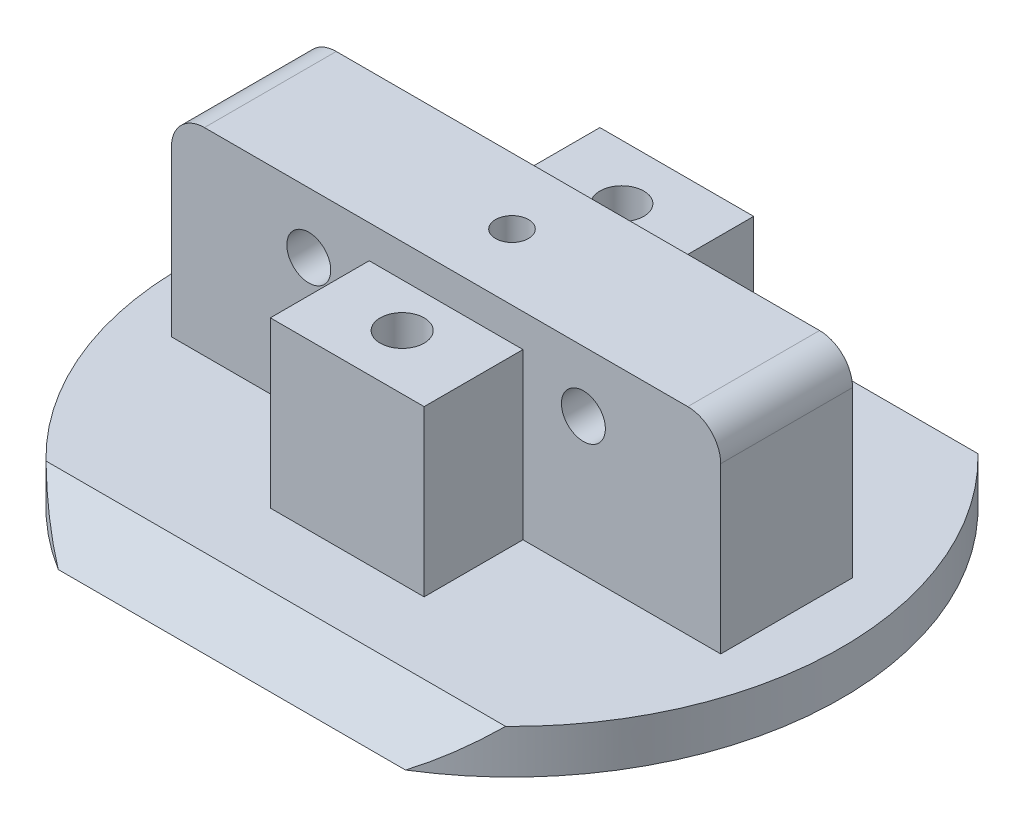
ISO-10303-21;
HEADER;
FILE_DESCRIPTION(('STEP AP214'),'2;1');
FILE_NAME('part.step','',(''),(''),'','','');
FILE_SCHEMA(('AUTOMOTIVE_DESIGN { 1 0 10303 214 1 1 1 1 }'));
ENDSEC;
DATA;
#1=APPLICATION_CONTEXT('core data for automotive mechanical design processes');
#2=APPLICATION_PROTOCOL_DEFINITION('international standard','automotive_design',2000,#1);
#3=PRODUCT_CONTEXT('',#1,'mechanical');
#4=PRODUCT('Part','Part','',(#3));
#5=PRODUCT_RELATED_PRODUCT_CATEGORY('part','',(#4));
#6=PRODUCT_DEFINITION_FORMATION('','',#4);
#7=PRODUCT_DEFINITION_CONTEXT('part definition',#1,'design');
#8=PRODUCT_DEFINITION('design','',#6,#7);
#9=PRODUCT_DEFINITION_SHAPE('','',#8);
#10=(LENGTH_UNIT() NAMED_UNIT(*) SI_UNIT(.MILLI.,.METRE.));
#11=(NAMED_UNIT(*) PLANE_ANGLE_UNIT() SI_UNIT($,.RADIAN.));
#12=(NAMED_UNIT(*) SI_UNIT($,.STERADIAN.) SOLID_ANGLE_UNIT());
#13=UNCERTAINTY_MEASURE_WITH_UNIT(LENGTH_MEASURE(1.E-05),#10,'distance_accuracy_value','');
#14=(GEOMETRIC_REPRESENTATION_CONTEXT(3) GLOBAL_UNCERTAINTY_ASSIGNED_CONTEXT((#13)) GLOBAL_UNIT_ASSIGNED_CONTEXT((#10,
#11,#12)) REPRESENTATION_CONTEXT('',''));
#15=CARTESIAN_POINT('',(0.,0.,0.));
#16=DIRECTION('',(0.,0.,1.));
#17=DIRECTION('',(1.,0.,0.));
#18=AXIS2_PLACEMENT_3D('',#15,#16,#17);
#19=CARTESIAN_POINT('',(0.,4.,0.));
#20=DIRECTION('',(0.,1.,0.));
#21=DIRECTION('',(0.,0.,1.));
#22=AXIS2_PLACEMENT_3D('',#19,#20,#21);
#23=PLANE('',#22);
#24=DIRECTION('',(1.,0.,0.));
#25=VECTOR('',#24,1.);
#26=CARTESIAN_POINT('',(30.001,4.,21.5));
#27=LINE('',#26,#25);
#28=CARTESIAN_POINT('',(-20.9224759529077,4.,21.5));
#29=VERTEX_POINT('',#28);
#30=CARTESIAN_POINT('',(20.9224759529077,4.,21.5));
#31=VERTEX_POINT('',#30);
#32=EDGE_CURVE('E349',#29,#31,#27,.T.);
#33=ORIENTED_EDGE('',*,*,#32,.T.);
#34=CARTESIAN_POINT('',(0.,4.,0.));
#35=DIRECTION('',(0.,1.,0.));
#36=DIRECTION('',(0.,0.,1.));
#37=AXIS2_PLACEMENT_3D('',#34,#35,#36);
#38=CIRCLE('',#37,30.);
#39=CARTESIAN_POINT('',(20.9224759529077,4.,-21.5));
#40=VERTEX_POINT('',#39);
#41=EDGE_CURVE('E347',#31,#40,#38,.T.);
#42=ORIENTED_EDGE('',*,*,#41,.T.);
#43=DIRECTION('',(-1.,0.,0.));
#44=VECTOR('',#43,1.);
#45=CARTESIAN_POINT('',(30.001,4.,-21.5));
#46=LINE('',#45,#44);
#47=CARTESIAN_POINT('',(-20.9224759529077,4.,-21.5));
#48=VERTEX_POINT('',#47);
#49=EDGE_CURVE('E371',#40,#48,#46,.T.);
#50=ORIENTED_EDGE('',*,*,#49,.T.);
#51=CARTESIAN_POINT('',(0.,4.,0.));
#52=DIRECTION('',(0.,1.,0.));
#53=DIRECTION('',(0.,0.,1.));
#54=AXIS2_PLACEMENT_3D('',#51,#52,#53);
#55=CIRCLE('',#54,30.);
#56=EDGE_CURVE('E345',#48,#29,#55,.T.);
#57=ORIENTED_EDGE('',*,*,#56,.T.);
#58=EDGE_LOOP('',(#33,#42,#50,#57));
#59=FACE_BOUND('',#58,.T.);
#60=DIRECTION('',(1.,0.,0.));
#61=VECTOR('',#60,1.);
#62=CARTESIAN_POINT('',(-7.,4.,15.));
#63=LINE('',#62,#61);
#64=CARTESIAN_POINT('',(-7.,4.,15.));
#65=VERTEX_POINT('',#64);
#66=CARTESIAN_POINT('',(7.,4.,15.));
#67=VERTEX_POINT('',#66);
#68=EDGE_CURVE('E185',#65,#67,#63,.T.);
#69=ORIENTED_EDGE('',*,*,#68,.F.);
#70=DIRECTION('',(0.,0.,-1.));
#71=VECTOR('',#70,1.);
#72=CARTESIAN_POINT('',(-7.,4.,15.));
#73=LINE('',#72,#71);
#74=CARTESIAN_POINT('',(-7.,4.,6.));
#75=VERTEX_POINT('',#74);
#76=EDGE_CURVE('E215',#65,#75,#73,.T.);
#77=ORIENTED_EDGE('',*,*,#76,.T.);
#78=DIRECTION('',(1.,0.,0.));
#79=VECTOR('',#78,1.);
#80=CARTESIAN_POINT('',(-25.,4.,6.));
#81=LINE('',#80,#79);
#82=CARTESIAN_POINT('',(-25.,4.,6.));
#83=VERTEX_POINT('',#82);
#84=EDGE_CURVE('E266',#83,#75,#81,.T.);
#85=ORIENTED_EDGE('',*,*,#84,.F.);
#86=DIRECTION('',(0.,0.,1.));
#87=VECTOR('',#86,1.);
#88=CARTESIAN_POINT('',(-25.,4.,-6.));
#89=LINE('',#88,#87);
#90=CARTESIAN_POINT('',(-25.,4.,-6.));
#91=VERTEX_POINT('',#90);
#92=EDGE_CURVE('E275',#91,#83,#89,.T.);
#93=ORIENTED_EDGE('',*,*,#92,.F.);
#94=DIRECTION('',(-1.,0.,0.));
#95=VECTOR('',#94,1.);
#96=CARTESIAN_POINT('',(-25.,4.,-6.));
#97=LINE('',#96,#95);
#98=CARTESIAN_POINT('',(-7.,4.,-6.));
#99=VERTEX_POINT('',#98);
#100=EDGE_CURVE('E271',#99,#91,#97,.T.);
#101=ORIENTED_EDGE('',*,*,#100,.F.);
#102=DIRECTION('',(0.,0.,1.));
#103=VECTOR('',#102,1.);
#104=CARTESIAN_POINT('',(-7.,4.,-15.));
#105=LINE('',#104,#103);
#106=CARTESIAN_POINT('',(-7.,4.,-15.));
#107=VERTEX_POINT('',#106);
#108=EDGE_CURVE('E256',#107,#99,#105,.T.);
#109=ORIENTED_EDGE('',*,*,#108,.F.);
#110=DIRECTION('',(-1.,0.,0.));
#111=VECTOR('',#110,1.);
#112=CARTESIAN_POINT('',(7.,4.,-15.));
#113=LINE('',#112,#111);
#114=CARTESIAN_POINT('',(7.,4.,-15.));
#115=VERTEX_POINT('',#114);
#116=EDGE_CURVE('E235',#115,#107,#113,.T.);
#117=ORIENTED_EDGE('',*,*,#116,.F.);
#118=DIRECTION('',(0.,0.,1.));
#119=VECTOR('',#118,1.);
#120=CARTESIAN_POINT('',(7.,4.,-15.));
#121=LINE('',#120,#119);
#122=CARTESIAN_POINT('',(7.,4.,-6.));
#123=VERTEX_POINT('',#122);
#124=EDGE_CURVE('E259',#115,#123,#121,.T.);
#125=ORIENTED_EDGE('',*,*,#124,.T.);
#126=CARTESIAN_POINT('',(25.,4.,-6.));
#127=VERTEX_POINT('',#126);
#128=EDGE_CURVE('E272',#127,#123,#97,.T.);
#129=ORIENTED_EDGE('',*,*,#128,.F.);
#130=DIRECTION('',(0.,0.,-1.));
#131=VECTOR('',#130,1.);
#132=CARTESIAN_POINT('',(25.,4.,-6.));
#133=LINE('',#132,#131);
#134=CARTESIAN_POINT('',(25.,4.,6.));
#135=VERTEX_POINT('',#134);
#136=EDGE_CURVE('E261',#135,#127,#133,.T.);
#137=ORIENTED_EDGE('',*,*,#136,.F.);
#138=CARTESIAN_POINT('',(7.,4.,6.));
#139=VERTEX_POINT('',#138);
#140=EDGE_CURVE('E278',#139,#135,#81,.T.);
#141=ORIENTED_EDGE('',*,*,#140,.F.);
#142=DIRECTION('',(0.,0.,-1.));
#143=VECTOR('',#142,1.);
#144=CARTESIAN_POINT('',(7.,4.,15.));
#145=LINE('',#144,#143);
#146=EDGE_CURVE('E196',#67,#139,#145,.T.);
#147=ORIENTED_EDGE('',*,*,#146,.F.);
#148=EDGE_LOOP('',(#69,#77,#85,#93,#101,#109,#117,#125,#129,#137,#141,#147));
#149=FACE_BOUND('',#148,.T.);
#150=ADVANCED_FACE('F54',(#59,#149),#23,.T.);
#151=CARTESIAN_POINT('',(-25.,22.,6.));
#152=DIRECTION('',(0.,0.,-1.));
#153=DIRECTION('',(-1.,0.,0.));
#154=AXIS2_PLACEMENT_3D('',#151,#152,#153);
#155=PLANE('',#154);
#156=CARTESIAN_POINT('',(-12.5,16.5,6.));
#157=DIRECTION('',(0.,0.,-1.));
#158=DIRECTION('',(-1.,0.,0.));
#159=AXIS2_PLACEMENT_3D('',#156,#157,#158);
#160=CIRCLE('',#159,2.);
#161=CARTESIAN_POINT('',(-14.5,16.5,6.));
#162=VERTEX_POINT('',#161);
#163=EDGE_CURVE('E221',#162,#162,#160,.T.);
#164=ORIENTED_EDGE('',*,*,#163,.T.);
#165=EDGE_LOOP('',(#164));
#166=FACE_BOUND('',#165,.T.);
#167=CARTESIAN_POINT('',(12.5,16.5,6.));
#168=DIRECTION('',(0.,0.,-1.));
#169=DIRECTION('',(-1.,0.,0.));
#170=AXIS2_PLACEMENT_3D('',#167,#168,#169);
#171=CIRCLE('',#170,2.);
#172=CARTESIAN_POINT('',(10.5,16.5,6.));
#173=VERTEX_POINT('',#172);
#174=EDGE_CURVE('E227',#173,#173,#171,.T.);
#175=ORIENTED_EDGE('',*,*,#174,.T.);
#176=EDGE_LOOP('',(#175));
#177=FACE_BOUND('',#176,.T.);
#178=DIRECTION('',(1.,0.,0.));
#179=VECTOR('',#178,1.);
#180=CARTESIAN_POINT('',(-25.,22.,6.));
#181=LINE('',#180,#179);
#182=CARTESIAN_POINT('',(-22.,22.,6.));
#183=VERTEX_POINT('',#182);
#184=CARTESIAN_POINT('',(22.,22.,6.));
#185=VERTEX_POINT('',#184);
#186=EDGE_CURVE('E265',#183,#185,#181,.T.);
#187=ORIENTED_EDGE('',*,*,#186,.F.);
#188=CARTESIAN_POINT('',(-22.,19.,6.));
#189=DIRECTION('',(0.,0.,-1.));
#190=DIRECTION('',(-1.,0.,0.));
#191=AXIS2_PLACEMENT_3D('',#188,#189,#190);
#192=CIRCLE('',#191,3.);
#193=CARTESIAN_POINT('',(-25.,19.,6.));
#194=VERTEX_POINT('',#193);
#195=EDGE_CURVE('E77',#183,#194,#192,.F.);
#196=ORIENTED_EDGE('',*,*,#195,.T.);
#197=DIRECTION('',(0.,-1.,0.));
#198=VECTOR('',#197,1.);
#199=CARTESIAN_POINT('',(-25.,22.,6.));
#200=LINE('',#199,#198);
#201=EDGE_CURVE('E282',#194,#83,#200,.T.);
#202=ORIENTED_EDGE('',*,*,#201,.T.);
#203=ORIENTED_EDGE('',*,*,#84,.T.);
#204=DIRECTION('',(0.,-1.,0.));
#205=VECTOR('',#204,1.);
#206=CARTESIAN_POINT('',(-7.,4.,6.));
#207=LINE('',#206,#205);
#208=CARTESIAN_POINT('',(-7.,19.,6.));
#209=VERTEX_POINT('',#208);
#210=EDGE_CURVE('E206',#209,#75,#207,.T.);
#211=ORIENTED_EDGE('',*,*,#210,.F.);
#212=DIRECTION('',(-1.,0.,0.));
#213=VECTOR('',#212,1.);
#214=CARTESIAN_POINT('',(-7.,19.,6.));
#215=LINE('',#214,#213);
#216=CARTESIAN_POINT('',(7.,19.,6.));
#217=VERTEX_POINT('',#216);
#218=EDGE_CURVE('E211',#217,#209,#215,.T.);
#219=ORIENTED_EDGE('',*,*,#218,.F.);
#220=DIRECTION('',(0.,1.,0.));
#221=VECTOR('',#220,1.);
#222=CARTESIAN_POINT('',(7.,4.,6.));
#223=LINE('',#222,#221);
#224=EDGE_CURVE('E193',#139,#217,#223,.T.);
#225=ORIENTED_EDGE('',*,*,#224,.F.);
#226=ORIENTED_EDGE('',*,*,#140,.T.);
#227=DIRECTION('',(0.,-1.,0.));
#228=VECTOR('',#227,1.);
#229=CARTESIAN_POINT('',(25.,22.,6.));
#230=LINE('',#229,#228);
#231=CARTESIAN_POINT('',(25.,19.,6.));
#232=VERTEX_POINT('',#231);
#233=EDGE_CURVE('E268',#232,#135,#230,.T.);
#234=ORIENTED_EDGE('',*,*,#233,.F.);
#235=CARTESIAN_POINT('',(22.,19.,6.));
#236=DIRECTION('',(0.,0.,-1.));
#237=DIRECTION('',(-1.,0.,0.));
#238=AXIS2_PLACEMENT_3D('',#235,#236,#237);
#239=CIRCLE('',#238,3.);
#240=EDGE_CURVE('E384',#232,#185,#239,.F.);
#241=ORIENTED_EDGE('',*,*,#240,.T.);
#242=EDGE_LOOP('',(#187,#196,#202,#203,#211,#219,#225,#226,#234,#241));
#243=FACE_BOUND('',#242,.T.);
#244=ADVANCED_FACE('F397',(#166,#177,#243),#155,.F.);
#245=CARTESIAN_POINT('',(-25.,22.,-6.));
#246=DIRECTION('',(0.,0.,1.));
#247=DIRECTION('',(1.,0.,0.));
#248=AXIS2_PLACEMENT_3D('',#245,#246,#247);
#249=PLANE('',#248);
#250=CARTESIAN_POINT('',(12.5,16.5,-6.));
#251=DIRECTION('',(0.,0.,1.));
#252=DIRECTION('',(1.,0.,0.));
#253=AXIS2_PLACEMENT_3D('',#250,#251,#252);
#254=CIRCLE('',#253,2.);
#255=CARTESIAN_POINT('',(14.5,16.5,-6.));
#256=VERTEX_POINT('',#255);
#257=EDGE_CURVE('E228',#256,#256,#254,.T.);
#258=ORIENTED_EDGE('',*,*,#257,.T.);
#259=EDGE_LOOP('',(#258));
#260=FACE_BOUND('',#259,.T.);
#261=CARTESIAN_POINT('',(-12.5,16.5,-6.));
#262=DIRECTION('',(0.,0.,1.));
#263=DIRECTION('',(1.,0.,0.));
#264=AXIS2_PLACEMENT_3D('',#261,#262,#263);
#265=CIRCLE('',#264,2.);
#266=CARTESIAN_POINT('',(-10.5,16.5,-6.));
#267=VERTEX_POINT('',#266);
#268=EDGE_CURVE('E224',#267,#267,#265,.T.);
#269=ORIENTED_EDGE('',*,*,#268,.T.);
#270=EDGE_LOOP('',(#269));
#271=FACE_BOUND('',#270,.T.);
#272=DIRECTION('',(0.,-1.,0.));
#273=VECTOR('',#272,1.);
#274=CARTESIAN_POINT('',(-25.,22.,-6.));
#275=LINE('',#274,#273);
#276=CARTESIAN_POINT('',(-25.,19.,-6.));
#277=VERTEX_POINT('',#276);
#278=EDGE_CURVE('E284',#277,#91,#275,.T.);
#279=ORIENTED_EDGE('',*,*,#278,.F.);
#280=CARTESIAN_POINT('',(-22.,19.,-6.));
#281=DIRECTION('',(0.,0.,1.));
#282=DIRECTION('',(1.,0.,0.));
#283=AXIS2_PLACEMENT_3D('',#280,#281,#282);
#284=CIRCLE('',#283,3.);
#285=CARTESIAN_POINT('',(-22.,22.,-6.));
#286=VERTEX_POINT('',#285);
#287=EDGE_CURVE('E13',#277,#286,#284,.F.);
#288=ORIENTED_EDGE('',*,*,#287,.T.);
#289=DIRECTION('',(-1.,0.,0.));
#290=VECTOR('',#289,1.);
#291=CARTESIAN_POINT('',(-25.,22.,-6.));
#292=LINE('',#291,#290);
#293=CARTESIAN_POINT('',(22.,22.,-6.));
#294=VERTEX_POINT('',#293);
#295=EDGE_CURVE('E262',#294,#286,#292,.T.);
#296=ORIENTED_EDGE('',*,*,#295,.F.);
#297=CARTESIAN_POINT('',(22.,19.,-6.));
#298=DIRECTION('',(0.,0.,1.));
#299=DIRECTION('',(1.,0.,0.));
#300=AXIS2_PLACEMENT_3D('',#297,#298,#299);
#301=CIRCLE('',#300,3.);
#302=CARTESIAN_POINT('',(25.,19.,-6.));
#303=VERTEX_POINT('',#302);
#304=EDGE_CURVE('E380',#294,#303,#301,.F.);
#305=ORIENTED_EDGE('',*,*,#304,.T.);
#306=DIRECTION('',(0.,-1.,0.));
#307=VECTOR('',#306,1.);
#308=CARTESIAN_POINT('',(25.,22.,-6.));
#309=LINE('',#308,#307);
#310=EDGE_CURVE('E286',#303,#127,#309,.T.);
#311=ORIENTED_EDGE('',*,*,#310,.T.);
#312=ORIENTED_EDGE('',*,*,#128,.T.);
#313=DIRECTION('',(0.,-1.,0.));
#314=VECTOR('',#313,1.);
#315=CARTESIAN_POINT('',(7.,4.,-6.));
#316=LINE('',#315,#314);
#317=CARTESIAN_POINT('',(7.,19.,-6.));
#318=VERTEX_POINT('',#317);
#319=EDGE_CURVE('E231',#318,#123,#316,.T.);
#320=ORIENTED_EDGE('',*,*,#319,.F.);
#321=DIRECTION('',(1.,0.,0.));
#322=VECTOR('',#321,1.);
#323=CARTESIAN_POINT('',(7.,19.,-6.));
#324=LINE('',#323,#322);
#325=CARTESIAN_POINT('',(-7.,19.,-6.));
#326=VERTEX_POINT('',#325);
#327=EDGE_CURVE('E236',#326,#318,#324,.T.);
#328=ORIENTED_EDGE('',*,*,#327,.F.);
#329=DIRECTION('',(0.,1.,0.));
#330=VECTOR('',#329,1.);
#331=CARTESIAN_POINT('',(-7.,4.,-6.));
#332=LINE('',#331,#330);
#333=EDGE_CURVE('E246',#99,#326,#332,.T.);
#334=ORIENTED_EDGE('',*,*,#333,.F.);
#335=ORIENTED_EDGE('',*,*,#100,.T.);
#336=EDGE_LOOP('',(#279,#288,#296,#305,#311,#312,#320,#328,#334,#335));
#337=FACE_BOUND('',#336,.T.);
#338=ADVANCED_FACE('F406',(#260,#271,#337),#249,.F.);
#339=CARTESIAN_POINT('',(0.,0.,0.));
#340=DIRECTION('',(0.,1.,0.));
#341=DIRECTION('',(0.,0.,1.));
#342=AXIS2_PLACEMENT_3D('',#339,#340,#341);
#343=PLANE('',#342);
#344=CARTESIAN_POINT('',(22.,0.,0.));
#345=DIRECTION('',(0.,-1.,0.));
#346=DIRECTION('',(0.,0.,-1.));
#347=AXIS2_PLACEMENT_3D('',#344,#345,#346);
#348=CIRCLE('',#347,5.);
#349=CARTESIAN_POINT('',(22.,0.,-5.));
#350=VERTEX_POINT('',#349);
#351=EDGE_CURVE('E311',#350,#350,#348,.T.);
#352=ORIENTED_EDGE('',*,*,#351,.F.);
#353=EDGE_LOOP('',(#352));
#354=FACE_BOUND('',#353,.T.);
#355=CARTESIAN_POINT('',(0.,0.,15.));
#356=DIRECTION('',(0.,-1.,0.));
#357=DIRECTION('',(0.,0.,-1.));
#358=AXIS2_PLACEMENT_3D('',#355,#356,#357);
#359=CIRCLE('',#358,5.);
#360=CARTESIAN_POINT('',(0.,0.,10.));
#361=VERTEX_POINT('',#360);
#362=EDGE_CURVE('E317',#361,#361,#359,.T.);
#363=ORIENTED_EDGE('',*,*,#362,.F.);
#364=EDGE_LOOP('',(#363));
#365=FACE_BOUND('',#364,.T.);
#366=CARTESIAN_POINT('',(-22.,0.,0.));
#367=DIRECTION('',(0.,-1.,0.));
#368=DIRECTION('',(0.,0.,-1.));
#369=AXIS2_PLACEMENT_3D('',#366,#367,#368);
#370=CIRCLE('',#369,5.);
#371=CARTESIAN_POINT('',(-22.,0.,-5.));
#372=VERTEX_POINT('',#371);
#373=EDGE_CURVE('E323',#372,#372,#370,.T.);
#374=ORIENTED_EDGE('',*,*,#373,.F.);
#375=EDGE_LOOP('',(#374));
#376=FACE_BOUND('',#375,.T.);
#377=CARTESIAN_POINT('',(-14.,0.,12.));
#378=DIRECTION('',(0.,-1.,0.));
#379=DIRECTION('',(0.,0.,-1.));
#380=AXIS2_PLACEMENT_3D('',#377,#378,#379);
#381=CIRCLE('',#380,5.);
#382=CARTESIAN_POINT('',(-14.,0.,7.));
#383=VERTEX_POINT('',#382);
#384=EDGE_CURVE('E292',#383,#383,#381,.T.);
#385=ORIENTED_EDGE('',*,*,#384,.F.);
#386=EDGE_LOOP('',(#385));
#387=FACE_BOUND('',#386,.T.);
#388=CARTESIAN_POINT('',(14.,0.,12.));
#389=DIRECTION('',(0.,-1.,0.));
#390=DIRECTION('',(0.,0.,-1.));
#391=AXIS2_PLACEMENT_3D('',#388,#389,#390);
#392=CIRCLE('',#391,5.);
#393=CARTESIAN_POINT('',(14.,0.,7.));
#394=VERTEX_POINT('',#393);
#395=EDGE_CURVE('E293',#394,#394,#392,.T.);
#396=ORIENTED_EDGE('',*,*,#395,.F.);
#397=EDGE_LOOP('',(#396));
#398=FACE_BOUND('',#397,.T.);
#399=CARTESIAN_POINT('',(14.,0.,-12.));
#400=DIRECTION('',(0.,-1.,0.));
#401=DIRECTION('',(0.,0.,-1.));
#402=AXIS2_PLACEMENT_3D('',#399,#400,#401);
#403=CIRCLE('',#402,5.);
#404=CARTESIAN_POINT('',(14.,0.,-17.));
#405=VERTEX_POINT('',#404);
#406=EDGE_CURVE('E299',#405,#405,#403,.T.);
#407=ORIENTED_EDGE('',*,*,#406,.F.);
#408=EDGE_LOOP('',(#407));
#409=FACE_BOUND('',#408,.T.);
#410=CARTESIAN_POINT('',(-14.,0.,-12.));
#411=DIRECTION('',(0.,-1.,0.));
#412=DIRECTION('',(0.,0.,-1.));
#413=AXIS2_PLACEMENT_3D('',#410,#411,#412);
#414=CIRCLE('',#413,5.);
#415=CARTESIAN_POINT('',(-14.,0.,-17.));
#416=VERTEX_POINT('',#415);
#417=EDGE_CURVE('E288',#416,#416,#414,.T.);
#418=ORIENTED_EDGE('',*,*,#417,.F.);
#419=EDGE_LOOP('',(#418));
#420=FACE_BOUND('',#419,.T.);
#421=CARTESIAN_POINT('',(0.,0.,-15.));
#422=DIRECTION('',(0.,-1.,0.));
#423=DIRECTION('',(0.,0.,-1.));
#424=AXIS2_PLACEMENT_3D('',#421,#422,#423);
#425=CIRCLE('',#424,5.);
#426=CARTESIAN_POINT('',(0.,0.,-20.));
#427=VERTEX_POINT('',#426);
#428=EDGE_CURVE('E310',#427,#427,#425,.T.);
#429=ORIENTED_EDGE('',*,*,#428,.F.);
#430=EDGE_LOOP('',(#429));
#431=FACE_BOUND('',#430,.T.);
#432=CARTESIAN_POINT('',(0.,0.,0.));
#433=DIRECTION('',(0.,1.,0.));
#434=DIRECTION('',(0.,0.,1.));
#435=AXIS2_PLACEMENT_3D('',#432,#433,#434);
#436=CIRCLE('',#435,1.5);
#437=CARTESIAN_POINT('',(0.,0.,1.5));
#438=VERTEX_POINT('',#437);
#439=EDGE_CURVE('E334',#438,#438,#436,.T.);
#440=ORIENTED_EDGE('',*,*,#439,.T.);
#441=EDGE_LOOP('',(#440));
#442=FACE_BOUND('',#441,.T.);
#443=CARTESIAN_POINT('',(-8.,0.,0.));
#444=DIRECTION('',(0.,1.,0.));
#445=DIRECTION('',(0.,0.,1.));
#446=AXIS2_PLACEMENT_3D('',#443,#444,#445);
#447=CIRCLE('',#446,5.);
#448=CARTESIAN_POINT('',(-8.,0.,5.));
#449=VERTEX_POINT('',#448);
#450=EDGE_CURVE('E342',#449,#449,#447,.T.);
#451=ORIENTED_EDGE('',*,*,#450,.T.);
#452=EDGE_LOOP('',(#451));
#453=FACE_BOUND('',#452,.T.);
#454=CARTESIAN_POINT('',(8.,0.,0.));
#455=DIRECTION('',(0.,1.,0.));
#456=DIRECTION('',(0.,0.,1.));
#457=AXIS2_PLACEMENT_3D('',#454,#455,#456);
#458=CIRCLE('',#457,5.);
#459=CARTESIAN_POINT('',(8.,0.,5.));
#460=VERTEX_POINT('',#459);
#461=EDGE_CURVE('E339',#460,#460,#458,.T.);
#462=ORIENTED_EDGE('',*,*,#461,.T.);
#463=EDGE_LOOP('',(#462));
#464=FACE_BOUND('',#463,.T.);
#465=DIRECTION('',(1.,0.,0.));
#466=VECTOR('',#465,1.);
#467=CARTESIAN_POINT('',(0.,0.,25.5));
#468=LINE('',#467,#466);
#469=CARTESIAN_POINT('',(-15.8034806292791,0.,25.5));
#470=VERTEX_POINT('',#469);
#471=CARTESIAN_POINT('',(15.8034806292791,0.,25.5));
#472=VERTEX_POINT('',#471);
#473=EDGE_CURVE('E351',#470,#472,#468,.T.);
#474=ORIENTED_EDGE('',*,*,#473,.F.);
#475=CARTESIAN_POINT('',(0.,0.,0.));
#476=DIRECTION('',(0.,1.,0.));
#477=DIRECTION('',(0.,0.,1.));
#478=AXIS2_PLACEMENT_3D('',#475,#476,#477);
#479=CIRCLE('',#478,30.);
#480=CARTESIAN_POINT('',(-15.8034806292789,0.,-25.5000000000001));
#481=VERTEX_POINT('',#480);
#482=EDGE_CURVE('E368',#481,#470,#479,.T.);
#483=ORIENTED_EDGE('',*,*,#482,.F.);
#484=DIRECTION('',(-1.,0.,0.));
#485=VECTOR('',#484,1.);
#486=CARTESIAN_POINT('',(0.,0.,-25.5000000000001));
#487=LINE('',#486,#485);
#488=CARTESIAN_POINT('',(15.8034806292789,0.,-25.5000000000001));
#489=VERTEX_POINT('',#488);
#490=EDGE_CURVE('E354',#489,#481,#487,.T.);
#491=ORIENTED_EDGE('',*,*,#490,.F.);
#492=EDGE_CURVE('E365',#472,#489,#479,.T.);
#493=ORIENTED_EDGE('',*,*,#492,.F.);
#494=EDGE_LOOP('',(#474,#483,#491,#493));
#495=FACE_BOUND('',#494,.T.);
#496=ADVANCED_FACE('F436',(#354,#365,#376,#387,#398,#409,#420,#431,#442,#453,#464,#495),#343,.F.);
#497=CARTESIAN_POINT('',(0.,4.,0.));
#498=DIRECTION('',(0.,-1.,0.));
#499=DIRECTION('',(0.,0.,-1.));
#500=AXIS2_PLACEMENT_3D('',#497,#498,#499);
#501=CYLINDRICAL_SURFACE('',#500,30.);
#502=ORIENTED_EDGE('',*,*,#41,.F.);
#503=CARTESIAN_POINT('',(0.,25.4999999999998,0.));
#504=DIRECTION('',(0.,-0.707106781186551,-0.707106781186544));
#505=DIRECTION('',(0.,-0.707106781186544,0.707106781186551));
#506=AXIS2_PLACEMENT_3D('',#503,#504,#505);
#507=ELLIPSE('',#506,42.4264068711926,30.);
#508=EDGE_CURVE('E362',#472,#31,#507,.F.);
#509=ORIENTED_EDGE('',*,*,#508,.F.);
#510=ORIENTED_EDGE('',*,*,#492,.T.);
#511=CARTESIAN_POINT('',(0.,25.4999999999995,0.));
#512=DIRECTION('',(0.,-0.707106781186556,0.707106781186539));
#513=DIRECTION('',(0.,-0.707106781186539,-0.707106781186556));
#514=AXIS2_PLACEMENT_3D('',#511,#512,#513);
#515=ELLIPSE('',#514,42.4264068711924,30.);
#516=EDGE_CURVE('E363',#40,#489,#515,.F.);
#517=ORIENTED_EDGE('',*,*,#516,.F.);
#518=EDGE_LOOP('',(#502,#509,#510,#517));
#519=FACE_BOUND('',#518,.T.);
#520=ADVANCED_FACE('F439',(#519),#501,.T.);
#521=ORIENTED_EDGE('',*,*,#56,.F.);
#522=CARTESIAN_POINT('',(0.,25.4999999999995,0.));
#523=DIRECTION('',(0.,0.707106781186556,-0.707106781186539));
#524=DIRECTION('',(0.,-0.707106781186539,-0.707106781186556));
#525=AXIS2_PLACEMENT_3D('',#522,#523,#524);
#526=ELLIPSE('',#525,42.4264068711924,30.);
#527=EDGE_CURVE('E357',#48,#481,#526,.F.);
#528=ORIENTED_EDGE('',*,*,#527,.T.);
#529=ORIENTED_EDGE('',*,*,#482,.T.);
#530=CARTESIAN_POINT('',(0.,25.4999999999998,0.));
#531=DIRECTION('',(0.,0.707106781186551,0.707106781186544));
#532=DIRECTION('',(0.,-0.707106781186544,0.707106781186551));
#533=AXIS2_PLACEMENT_3D('',#530,#531,#532);
#534=ELLIPSE('',#533,42.4264068711926,30.);
#535=EDGE_CURVE('E359',#470,#29,#534,.F.);
#536=ORIENTED_EDGE('',*,*,#535,.T.);
#537=EDGE_LOOP('',(#521,#528,#529,#536));
#538=FACE_BOUND('',#537,.T.);
#539=ADVANCED_FACE('F431',(#538),#501,.T.);
#540=CARTESIAN_POINT('',(30.001,16.5,8.99999999999987));
#541=DIRECTION('',(0.,-0.707106781186551,-0.707106781186544));
#542=DIRECTION('',(0.,0.707106781186544,-0.707106781186551));
#543=AXIS2_PLACEMENT_3D('',#540,#541,#542);
#544=PLANE('',#543);
#545=ORIENTED_EDGE('',*,*,#32,.F.);
#546=ORIENTED_EDGE('',*,*,#535,.F.);
#547=ORIENTED_EDGE('',*,*,#473,.T.);
#548=ORIENTED_EDGE('',*,*,#508,.T.);
#549=EDGE_LOOP('',(#545,#546,#547,#548));
#550=FACE_BOUND('',#549,.T.);
#551=ADVANCED_FACE('F427',(#550),#544,.F.);
#552=CARTESIAN_POINT('',(30.001,16.5,-8.99999999999971));
#553=DIRECTION('',(0.,-0.707106781186556,0.707106781186539));
#554=DIRECTION('',(0.,-0.707106781186539,-0.707106781186556));
#555=AXIS2_PLACEMENT_3D('',#552,#553,#554);
#556=PLANE('',#555);
#557=ORIENTED_EDGE('',*,*,#49,.F.);
#558=ORIENTED_EDGE('',*,*,#516,.T.);
#559=ORIENTED_EDGE('',*,*,#490,.T.);
#560=ORIENTED_EDGE('',*,*,#527,.F.);
#561=EDGE_LOOP('',(#557,#558,#559,#560));
#562=FACE_BOUND('',#561,.T.);
#563=ADVANCED_FACE('F430',(#562),#556,.F.);
#564=CARTESIAN_POINT('',(8.,-7.50000000000001,0.));
#565=DIRECTION('',(0.,1.,0.));
#566=DIRECTION('',(0.,0.,1.));
#567=AXIS2_PLACEMENT_3D('',#564,#565,#566);
#568=CYLINDRICAL_SURFACE('',#567,5.);
#569=ORIENTED_EDGE('',*,*,#461,.F.);
#570=EDGE_LOOP('',(#569));
#571=FACE_BOUND('',#570,.T.);
#572=CARTESIAN_POINT('',(8.,13.,0.));
#573=DIRECTION('',(0.,-1.,0.));
#574=DIRECTION('',(0.,0.,-1.));
#575=AXIS2_PLACEMENT_3D('',#572,#573,#574);
#576=CIRCLE('',#575,5.);
#577=CARTESIAN_POINT('',(8.,13.,-5.));
#578=VERTEX_POINT('',#577);
#579=EDGE_CURVE('E928',#578,#578,#576,.T.);
#580=ORIENTED_EDGE('',*,*,#579,.F.);
#581=EDGE_LOOP('',(#580));
#582=FACE_BOUND('',#581,.T.);
#583=ADVANCED_FACE('F425',(#571,#582),#568,.F.);
#584=CARTESIAN_POINT('',(-8.,-7.50000000000001,0.));
#585=DIRECTION('',(0.,1.,0.));
#586=DIRECTION('',(0.,0.,1.));
#587=AXIS2_PLACEMENT_3D('',#584,#585,#586);
#588=CYLINDRICAL_SURFACE('',#587,5.);
#589=ORIENTED_EDGE('',*,*,#450,.F.);
#590=EDGE_LOOP('',(#589));
#591=FACE_BOUND('',#590,.T.);
#592=CARTESIAN_POINT('',(-8.,13.,0.));
#593=DIRECTION('',(0.,-1.,0.));
#594=DIRECTION('',(0.,0.,-1.));
#595=AXIS2_PLACEMENT_3D('',#592,#593,#594);
#596=CIRCLE('',#595,5.);
#597=CARTESIAN_POINT('',(-8.,13.,-5.));
#598=VERTEX_POINT('',#597);
#599=EDGE_CURVE('E930',#598,#598,#596,.T.);
#600=ORIENTED_EDGE('',*,*,#599,.F.);
#601=EDGE_LOOP('',(#600));
#602=FACE_BOUND('',#601,.T.);
#603=ADVANCED_FACE('F476',(#591,#602),#588,.F.);
#604=CARTESIAN_POINT('',(0.,-13.5,0.));
#605=DIRECTION('',(0.,1.,0.));
#606=DIRECTION('',(0.,0.,1.));
#607=AXIS2_PLACEMENT_3D('',#604,#605,#606);
#608=CYLINDRICAL_SURFACE('',#607,1.5);
#609=ORIENTED_EDGE('',*,*,#439,.F.);
#610=EDGE_LOOP('',(#609));
#611=FACE_BOUND('',#610,.T.);
#612=CARTESIAN_POINT('',(0.,22.,0.));
#613=DIRECTION('',(0.,1.,0.));
#614=DIRECTION('',(0.,0.,1.));
#615=AXIS2_PLACEMENT_3D('',#612,#613,#614);
#616=CIRCLE('',#615,1.5);
#617=CARTESIAN_POINT('',(0.,22.,1.5));
#618=VERTEX_POINT('',#617);
#619=EDGE_CURVE('E58',#618,#618,#616,.T.);
#620=ORIENTED_EDGE('',*,*,#619,.T.);
#621=EDGE_LOOP('',(#620));
#622=FACE_BOUND('',#621,.T.);
#623=ADVANCED_FACE('F485',(#611,#622),#608,.F.);
#624=CARTESIAN_POINT('',(0.,3.,-15.));
#625=DIRECTION('',(0.,-1.,0.));
#626=DIRECTION('',(0.,0.,-1.));
#627=AXIS2_PLACEMENT_3D('',#624,#625,#626);
#628=CYLINDRICAL_SURFACE('',#627,5.);
#629=CARTESIAN_POINT('',(0.,3.,-15.));
#630=DIRECTION('',(0.,-1.,0.));
#631=DIRECTION('',(0.,0.,-1.));
#632=AXIS2_PLACEMENT_3D('',#629,#630,#631);
#633=CIRCLE('',#632,5.);
#634=CARTESIAN_POINT('',(0.,3.,-20.));
#635=VERTEX_POINT('',#634);
#636=EDGE_CURVE('E331',#635,#635,#633,.T.);
#637=ORIENTED_EDGE('',*,*,#636,.F.);
#638=EDGE_LOOP('',(#637));
#639=FACE_BOUND('',#638,.T.);
#640=ORIENTED_EDGE('',*,*,#428,.T.);
#641=EDGE_LOOP('',(#640));
#642=FACE_BOUND('',#641,.T.);
#643=ADVANCED_FACE('F493',(#639,#642),#628,.F.);
#644=CARTESIAN_POINT('',(0.,3.,-15.));
#645=DIRECTION('',(0.,-1.,0.));
#646=DIRECTION('',(0.,0.,-1.));
#647=AXIS2_PLACEMENT_3D('',#644,#645,#646);
#648=PLANE('',#647);
#649=ORIENTED_EDGE('',*,*,#636,.T.);
#650=EDGE_LOOP('',(#649));
#651=FACE_BOUND('',#650,.T.);
#652=ADVANCED_FACE('F502',(#651),#648,.T.);
#653=CARTESIAN_POINT('',(-14.,3.,-12.));
#654=DIRECTION('',(0.,-1.,0.));
#655=DIRECTION('',(0.,0.,-1.));
#656=AXIS2_PLACEMENT_3D('',#653,#654,#655);
#657=CYLINDRICAL_SURFACE('',#656,5.);
#658=CARTESIAN_POINT('',(-14.,3.,-12.));
#659=DIRECTION('',(0.,-1.,0.));
#660=DIRECTION('',(0.,0.,-1.));
#661=AXIS2_PLACEMENT_3D('',#658,#659,#660);
#662=CIRCLE('',#661,5.);
#663=CARTESIAN_POINT('',(-14.,3.,-17.));
#664=VERTEX_POINT('',#663);
#665=EDGE_CURVE('E302',#664,#664,#662,.T.);
#666=ORIENTED_EDGE('',*,*,#665,.F.);
#667=EDGE_LOOP('',(#666));
#668=FACE_BOUND('',#667,.T.);
#669=ORIENTED_EDGE('',*,*,#417,.T.);
#670=EDGE_LOOP('',(#669));
#671=FACE_BOUND('',#670,.T.);
#672=ADVANCED_FACE('F511',(#668,#671),#657,.F.);
#673=CARTESIAN_POINT('',(-14.,3.,-12.));
#674=DIRECTION('',(0.,-1.,0.));
#675=DIRECTION('',(0.,0.,-1.));
#676=AXIS2_PLACEMENT_3D('',#673,#674,#675);
#677=PLANE('',#676);
#678=ORIENTED_EDGE('',*,*,#665,.T.);
#679=EDGE_LOOP('',(#678));
#680=FACE_BOUND('',#679,.T.);
#681=ADVANCED_FACE('F519',(#680),#677,.T.);
#682=CARTESIAN_POINT('',(14.,3.,-12.));
#683=DIRECTION('',(0.,-1.,0.));
#684=DIRECTION('',(0.,0.,-1.));
#685=AXIS2_PLACEMENT_3D('',#682,#683,#684);
#686=CYLINDRICAL_SURFACE('',#685,5.);
#687=CARTESIAN_POINT('',(14.,3.,-12.));
#688=DIRECTION('',(0.,-1.,0.));
#689=DIRECTION('',(0.,0.,-1.));
#690=AXIS2_PLACEMENT_3D('',#687,#688,#689);
#691=CIRCLE('',#690,5.);
#692=CARTESIAN_POINT('',(14.,3.,-17.));
#693=VERTEX_POINT('',#692);
#694=EDGE_CURVE('E296',#693,#693,#691,.T.);
#695=ORIENTED_EDGE('',*,*,#694,.F.);
#696=EDGE_LOOP('',(#695));
#697=FACE_BOUND('',#696,.T.);
#698=ORIENTED_EDGE('',*,*,#406,.T.);
#699=EDGE_LOOP('',(#698));
#700=FACE_BOUND('',#699,.T.);
#701=ADVANCED_FACE('F527',(#697,#700),#686,.F.);
#702=CARTESIAN_POINT('',(14.,3.,-12.));
#703=DIRECTION('',(0.,-1.,0.));
#704=DIRECTION('',(0.,0.,-1.));
#705=AXIS2_PLACEMENT_3D('',#702,#703,#704);
#706=PLANE('',#705);
#707=ORIENTED_EDGE('',*,*,#694,.T.);
#708=EDGE_LOOP('',(#707));
#709=FACE_BOUND('',#708,.T.);
#710=ADVANCED_FACE('F535',(#709),#706,.T.);
#711=CARTESIAN_POINT('',(14.,3.,12.));
#712=DIRECTION('',(0.,-1.,0.));
#713=DIRECTION('',(0.,0.,-1.));
#714=AXIS2_PLACEMENT_3D('',#711,#712,#713);
#715=CYLINDRICAL_SURFACE('',#714,5.);
#716=CARTESIAN_POINT('',(14.,3.,12.));
#717=DIRECTION('',(0.,-1.,0.));
#718=DIRECTION('',(0.,0.,-1.));
#719=AXIS2_PLACEMENT_3D('',#716,#717,#718);
#720=CIRCLE('',#719,5.);
#721=CARTESIAN_POINT('',(14.,3.,7.));
#722=VERTEX_POINT('',#721);
#723=EDGE_CURVE('E289',#722,#722,#720,.T.);
#724=ORIENTED_EDGE('',*,*,#723,.F.);
#725=EDGE_LOOP('',(#724));
#726=FACE_BOUND('',#725,.T.);
#727=ORIENTED_EDGE('',*,*,#395,.T.);
#728=EDGE_LOOP('',(#727));
#729=FACE_BOUND('',#728,.T.);
#730=ADVANCED_FACE('F543',(#726,#729),#715,.F.);
#731=CARTESIAN_POINT('',(14.,3.,12.));
#732=DIRECTION('',(0.,-1.,0.));
#733=DIRECTION('',(0.,0.,-1.));
#734=AXIS2_PLACEMENT_3D('',#731,#732,#733);
#735=PLANE('',#734);
#736=ORIENTED_EDGE('',*,*,#723,.T.);
#737=EDGE_LOOP('',(#736));
#738=FACE_BOUND('',#737,.T.);
#739=ADVANCED_FACE('F551',(#738),#735,.T.);
#740=CARTESIAN_POINT('',(-14.,3.,12.));
#741=DIRECTION('',(0.,-1.,0.));
#742=DIRECTION('',(0.,0.,-1.));
#743=AXIS2_PLACEMENT_3D('',#740,#741,#742);
#744=CYLINDRICAL_SURFACE('',#743,5.);
#745=CARTESIAN_POINT('',(-14.,3.,12.));
#746=DIRECTION('',(0.,-1.,0.));
#747=DIRECTION('',(0.,0.,-1.));
#748=AXIS2_PLACEMENT_3D('',#745,#746,#747);
#749=CIRCLE('',#748,5.);
#750=CARTESIAN_POINT('',(-14.,3.,7.));
#751=VERTEX_POINT('',#750);
#752=EDGE_CURVE('E326',#751,#751,#749,.T.);
#753=ORIENTED_EDGE('',*,*,#752,.F.);
#754=EDGE_LOOP('',(#753));
#755=FACE_BOUND('',#754,.T.);
#756=ORIENTED_EDGE('',*,*,#384,.T.);
#757=EDGE_LOOP('',(#756));
#758=FACE_BOUND('',#757,.T.);
#759=ADVANCED_FACE('F559',(#755,#758),#744,.F.);
#760=CARTESIAN_POINT('',(-14.,3.,12.));
#761=DIRECTION('',(0.,-1.,0.));
#762=DIRECTION('',(0.,0.,-1.));
#763=AXIS2_PLACEMENT_3D('',#760,#761,#762);
#764=PLANE('',#763);
#765=ORIENTED_EDGE('',*,*,#752,.T.);
#766=EDGE_LOOP('',(#765));
#767=FACE_BOUND('',#766,.T.);
#768=ADVANCED_FACE('F567',(#767),#764,.T.);
#769=CARTESIAN_POINT('',(-22.,3.,0.));
#770=DIRECTION('',(0.,-1.,0.));
#771=DIRECTION('',(0.,0.,-1.));
#772=AXIS2_PLACEMENT_3D('',#769,#770,#771);
#773=CYLINDRICAL_SURFACE('',#772,5.);
#774=CARTESIAN_POINT('',(-22.,3.,0.));
#775=DIRECTION('',(0.,-1.,0.));
#776=DIRECTION('',(0.,0.,-1.));
#777=AXIS2_PLACEMENT_3D('',#774,#775,#776);
#778=CIRCLE('',#777,5.);
#779=CARTESIAN_POINT('',(-22.,3.,-5.));
#780=VERTEX_POINT('',#779);
#781=EDGE_CURVE('E320',#780,#780,#778,.T.);
#782=ORIENTED_EDGE('',*,*,#781,.F.);
#783=EDGE_LOOP('',(#782));
#784=FACE_BOUND('',#783,.T.);
#785=ORIENTED_EDGE('',*,*,#373,.T.);
#786=EDGE_LOOP('',(#785));
#787=FACE_BOUND('',#786,.T.);
#788=ADVANCED_FACE('F575',(#784,#787),#773,.F.);
#789=CARTESIAN_POINT('',(-22.,3.,0.));
#790=DIRECTION('',(0.,-1.,0.));
#791=DIRECTION('',(0.,0.,-1.));
#792=AXIS2_PLACEMENT_3D('',#789,#790,#791);
#793=PLANE('',#792);
#794=ORIENTED_EDGE('',*,*,#781,.T.);
#795=EDGE_LOOP('',(#794));
#796=FACE_BOUND('',#795,.T.);
#797=ADVANCED_FACE('F583',(#796),#793,.T.);
#798=CARTESIAN_POINT('',(0.,3.,15.));
#799=DIRECTION('',(0.,-1.,0.));
#800=DIRECTION('',(0.,0.,-1.));
#801=AXIS2_PLACEMENT_3D('',#798,#799,#800);
#802=CYLINDRICAL_SURFACE('',#801,5.);
#803=CARTESIAN_POINT('',(0.,3.,15.));
#804=DIRECTION('',(0.,-1.,0.));
#805=DIRECTION('',(0.,0.,-1.));
#806=AXIS2_PLACEMENT_3D('',#803,#804,#805);
#807=CIRCLE('',#806,5.);
#808=CARTESIAN_POINT('',(0.,3.,10.));
#809=VERTEX_POINT('',#808);
#810=EDGE_CURVE('E314',#809,#809,#807,.T.);
#811=ORIENTED_EDGE('',*,*,#810,.F.);
#812=EDGE_LOOP('',(#811));
#813=FACE_BOUND('',#812,.T.);
#814=ORIENTED_EDGE('',*,*,#362,.T.);
#815=EDGE_LOOP('',(#814));
#816=FACE_BOUND('',#815,.T.);
#817=ADVANCED_FACE('F591',(#813,#816),#802,.F.);
#818=CARTESIAN_POINT('',(0.,3.,15.));
#819=DIRECTION('',(0.,-1.,0.));
#820=DIRECTION('',(0.,0.,-1.));
#821=AXIS2_PLACEMENT_3D('',#818,#819,#820);
#822=PLANE('',#821);
#823=ORIENTED_EDGE('',*,*,#810,.T.);
#824=EDGE_LOOP('',(#823));
#825=FACE_BOUND('',#824,.T.);
#826=ADVANCED_FACE('F599',(#825),#822,.T.);
#827=CARTESIAN_POINT('',(22.,3.,0.));
#828=DIRECTION('',(0.,-1.,0.));
#829=DIRECTION('',(0.,0.,-1.));
#830=AXIS2_PLACEMENT_3D('',#827,#828,#829);
#831=CYLINDRICAL_SURFACE('',#830,5.);
#832=CARTESIAN_POINT('',(22.,3.,0.));
#833=DIRECTION('',(0.,-1.,0.));
#834=DIRECTION('',(0.,0.,-1.));
#835=AXIS2_PLACEMENT_3D('',#832,#833,#834);
#836=CIRCLE('',#835,5.);
#837=CARTESIAN_POINT('',(22.,3.,-5.));
#838=VERTEX_POINT('',#837);
#839=EDGE_CURVE('E307',#838,#838,#836,.T.);
#840=ORIENTED_EDGE('',*,*,#839,.F.);
#841=EDGE_LOOP('',(#840));
#842=FACE_BOUND('',#841,.T.);
#843=ORIENTED_EDGE('',*,*,#351,.T.);
#844=EDGE_LOOP('',(#843));
#845=FACE_BOUND('',#844,.T.);
#846=ADVANCED_FACE('F607',(#842,#845),#831,.F.);
#847=CARTESIAN_POINT('',(22.,3.,0.));
#848=DIRECTION('',(0.,-1.,0.));
#849=DIRECTION('',(0.,0.,-1.));
#850=AXIS2_PLACEMENT_3D('',#847,#848,#849);
#851=PLANE('',#850);
#852=ORIENTED_EDGE('',*,*,#839,.T.);
#853=EDGE_LOOP('',(#852));
#854=FACE_BOUND('',#853,.T.);
#855=ADVANCED_FACE('F615',(#854),#851,.T.);
#856=CARTESIAN_POINT('',(25.,22.,-6.));
#857=DIRECTION('',(-1.,0.,0.));
#858=DIRECTION('',(0.,0.,1.));
#859=AXIS2_PLACEMENT_3D('',#856,#857,#858);
#860=PLANE('',#859);
#861=ORIENTED_EDGE('',*,*,#310,.F.);
#862=DIRECTION('',(0.,0.,-1.));
#863=VECTOR('',#862,1.);
#864=CARTESIAN_POINT('',(25.,19.,6.));
#865=LINE('',#864,#863);
#866=EDGE_CURVE('E382',#303,#232,#865,.F.);
#867=ORIENTED_EDGE('',*,*,#866,.T.);
#868=ORIENTED_EDGE('',*,*,#233,.T.);
#869=ORIENTED_EDGE('',*,*,#136,.T.);
#870=EDGE_LOOP('',(#861,#867,#868,#869));
#871=FACE_BOUND('',#870,.T.);
#872=ADVANCED_FACE('F623',(#871),#860,.F.);
#873=CARTESIAN_POINT('',(-25.,22.,-6.));
#874=DIRECTION('',(1.,0.,0.));
#875=DIRECTION('',(0.,0.,-1.));
#876=AXIS2_PLACEMENT_3D('',#873,#874,#875);
#877=PLANE('',#876);
#878=ORIENTED_EDGE('',*,*,#201,.F.);
#879=DIRECTION('',(0.,0.,1.));
#880=VECTOR('',#879,1.);
#881=CARTESIAN_POINT('',(-25.,19.,-6.));
#882=LINE('',#881,#880);
#883=EDGE_CURVE('E63',#194,#277,#882,.F.);
#884=ORIENTED_EDGE('',*,*,#883,.T.);
#885=ORIENTED_EDGE('',*,*,#278,.T.);
#886=ORIENTED_EDGE('',*,*,#92,.T.);
#887=EDGE_LOOP('',(#878,#884,#885,#886));
#888=FACE_BOUND('',#887,.T.);
#889=ADVANCED_FACE('F631',(#888),#877,.F.);
#890=CARTESIAN_POINT('',(0.,22.,0.));
#891=DIRECTION('',(0.,1.,0.));
#892=DIRECTION('',(0.,0.,1.));
#893=AXIS2_PLACEMENT_3D('',#890,#891,#892);
#894=PLANE('',#893);
#895=ORIENTED_EDGE('',*,*,#619,.F.);
#896=EDGE_LOOP('',(#895));
#897=FACE_BOUND('',#896,.T.);
#898=ORIENTED_EDGE('',*,*,#295,.T.);
#899=DIRECTION('',(0.,0.,1.));
#900=VECTOR('',#899,1.);
#901=CARTESIAN_POINT('',(-22.,22.,6.));
#902=LINE('',#901,#900);
#903=EDGE_CURVE('E387',#286,#183,#902,.T.);
#904=ORIENTED_EDGE('',*,*,#903,.T.);
#905=ORIENTED_EDGE('',*,*,#186,.T.);
#906=DIRECTION('',(0.,0.,-1.));
#907=VECTOR('',#906,1.);
#908=CARTESIAN_POINT('',(22.,22.,-6.));
#909=LINE('',#908,#907);
#910=EDGE_CURVE('E373',#185,#294,#909,.T.);
#911=ORIENTED_EDGE('',*,*,#910,.T.);
#912=EDGE_LOOP('',(#898,#904,#905,#911));
#913=FACE_BOUND('',#912,.T.);
#914=ADVANCED_FACE('F393',(#897,#913),#894,.T.);
#915=CARTESIAN_POINT('',(7.,4.,-15.));
#916=DIRECTION('',(-1.,0.,0.));
#917=DIRECTION('',(0.,-1.,0.));
#918=AXIS2_PLACEMENT_3D('',#915,#916,#917);
#919=PLANE('',#918);
#920=ORIENTED_EDGE('',*,*,#319,.T.);
#921=ORIENTED_EDGE('',*,*,#124,.F.);
#922=DIRECTION('',(0.,-1.,0.));
#923=VECTOR('',#922,1.);
#924=CARTESIAN_POINT('',(7.,4.,-15.));
#925=LINE('',#924,#923);
#926=CARTESIAN_POINT('',(7.,19.,-15.));
#927=VERTEX_POINT('',#926);
#928=EDGE_CURVE('E232',#927,#115,#925,.T.);
#929=ORIENTED_EDGE('',*,*,#928,.F.);
#930=DIRECTION('',(0.,0.,1.));
#931=VECTOR('',#930,1.);
#932=CARTESIAN_POINT('',(7.,19.,-15.));
#933=LINE('',#932,#931);
#934=EDGE_CURVE('E243',#927,#318,#933,.T.);
#935=ORIENTED_EDGE('',*,*,#934,.T.);
#936=EDGE_LOOP('',(#920,#921,#929,#935));
#937=FACE_BOUND('',#936,.T.);
#938=ADVANCED_FACE('F646',(#937),#919,.F.);
#939=CARTESIAN_POINT('',(-7.,4.,-15.));
#940=DIRECTION('',(1.,0.,0.));
#941=DIRECTION('',(0.,0.,-1.));
#942=AXIS2_PLACEMENT_3D('',#939,#940,#941);
#943=PLANE('',#942);
#944=ORIENTED_EDGE('',*,*,#333,.T.);
#945=DIRECTION('',(0.,0.,1.));
#946=VECTOR('',#945,1.);
#947=CARTESIAN_POINT('',(-7.,19.,-15.));
#948=LINE('',#947,#946);
#949=CARTESIAN_POINT('',(-7.,19.,-15.));
#950=VERTEX_POINT('',#949);
#951=EDGE_CURVE('E253',#950,#326,#948,.T.);
#952=ORIENTED_EDGE('',*,*,#951,.F.);
#953=DIRECTION('',(0.,1.,0.));
#954=VECTOR('',#953,1.);
#955=CARTESIAN_POINT('',(-7.,4.,-15.));
#956=LINE('',#955,#954);
#957=EDGE_CURVE('E239',#107,#950,#956,.T.);
#958=ORIENTED_EDGE('',*,*,#957,.F.);
#959=ORIENTED_EDGE('',*,*,#108,.T.);
#960=EDGE_LOOP('',(#944,#952,#958,#959));
#961=FACE_BOUND('',#960,.T.);
#962=ADVANCED_FACE('F653',(#961),#943,.F.);
#963=CARTESIAN_POINT('',(7.,19.,-15.));
#964=DIRECTION('',(0.,-1.,0.));
#965=DIRECTION('',(0.,0.,-1.));
#966=AXIS2_PLACEMENT_3D('',#963,#964,#965);
#967=PLANE('',#966);
#968=CARTESIAN_POINT('',(0.,19.,-10.));
#969=DIRECTION('',(0.,1.,0.));
#970=DIRECTION('',(0.,0.,1.));
#971=AXIS2_PLACEMENT_3D('',#968,#969,#970);
#972=CIRCLE('',#971,2.);
#973=CARTESIAN_POINT('',(0.,19.,-8.));
#974=VERTEX_POINT('',#973);
#975=EDGE_CURVE('E217',#974,#974,#972,.T.);
#976=ORIENTED_EDGE('',*,*,#975,.F.);
#977=EDGE_LOOP('',(#976));
#978=FACE_BOUND('',#977,.T.);
#979=ORIENTED_EDGE('',*,*,#327,.T.);
#980=ORIENTED_EDGE('',*,*,#934,.F.);
#981=DIRECTION('',(1.,0.,0.));
#982=VECTOR('',#981,1.);
#983=CARTESIAN_POINT('',(7.,19.,-15.));
#984=LINE('',#983,#982);
#985=EDGE_CURVE('E241',#950,#927,#984,.T.);
#986=ORIENTED_EDGE('',*,*,#985,.F.);
#987=ORIENTED_EDGE('',*,*,#951,.T.);
#988=EDGE_LOOP('',(#979,#980,#986,#987));
#989=FACE_BOUND('',#988,.T.);
#990=ADVANCED_FACE('F661',(#978,#989),#967,.F.);
#991=CARTESIAN_POINT('',(0.,0.,-15.));
#992=DIRECTION('',(0.,0.,1.));
#993=DIRECTION('',(1.,0.,0.));
#994=AXIS2_PLACEMENT_3D('',#991,#992,#993);
#995=PLANE('',#994);
#996=ORIENTED_EDGE('',*,*,#928,.T.);
#997=ORIENTED_EDGE('',*,*,#116,.T.);
#998=ORIENTED_EDGE('',*,*,#957,.T.);
#999=ORIENTED_EDGE('',*,*,#985,.T.);
#1000=EDGE_LOOP('',(#996,#997,#998,#999));
#1001=FACE_BOUND('',#1000,.T.);
#1002=ADVANCED_FACE('F670',(#1001),#995,.F.);
#1003=CARTESIAN_POINT('',(-12.5,16.5,25.5));
#1004=DIRECTION('',(0.,0.,-1.));
#1005=DIRECTION('',(-1.,0.,0.));
#1006=AXIS2_PLACEMENT_3D('',#1003,#1004,#1005);
#1007=CYLINDRICAL_SURFACE('',#1006,2.);
#1008=ORIENTED_EDGE('',*,*,#163,.F.);
#1009=EDGE_LOOP('',(#1008));
#1010=FACE_BOUND('',#1009,.T.);
#1011=ORIENTED_EDGE('',*,*,#268,.F.);
#1012=EDGE_LOOP('',(#1011));
#1013=FACE_BOUND('',#1012,.T.);
#1014=ADVANCED_FACE('F679',(#1010,#1013),#1007,.F.);
#1015=CARTESIAN_POINT('',(12.5,16.5,25.5));
#1016=DIRECTION('',(0.,0.,-1.));
#1017=DIRECTION('',(-1.,0.,0.));
#1018=AXIS2_PLACEMENT_3D('',#1015,#1016,#1017);
#1019=CYLINDRICAL_SURFACE('',#1018,2.);
#1020=ORIENTED_EDGE('',*,*,#174,.F.);
#1021=EDGE_LOOP('',(#1020));
#1022=FACE_BOUND('',#1021,.T.);
#1023=ORIENTED_EDGE('',*,*,#257,.F.);
#1024=EDGE_LOOP('',(#1023));
#1025=FACE_BOUND('',#1024,.T.);
#1026=ADVANCED_FACE('F687',(#1022,#1025),#1019,.F.);
#1027=CARTESIAN_POINT('',(0.,4.,-10.));
#1028=DIRECTION('',(0.,1.,0.));
#1029=DIRECTION('',(0.,0.,1.));
#1030=AXIS2_PLACEMENT_3D('',#1027,#1028,#1029);
#1031=CYLINDRICAL_SURFACE('',#1030,2.);
#1032=CARTESIAN_POINT('',(0.,4.,-10.));
#1033=DIRECTION('',(0.,1.,0.));
#1034=DIRECTION('',(0.,0.,1.));
#1035=AXIS2_PLACEMENT_3D('',#1032,#1033,#1034);
#1036=CIRCLE('',#1035,2.);
#1037=CARTESIAN_POINT('',(0.,4.,-8.));
#1038=VERTEX_POINT('',#1037);
#1039=EDGE_CURVE('E218',#1038,#1038,#1036,.T.);
#1040=ORIENTED_EDGE('',*,*,#1039,.F.);
#1041=EDGE_LOOP('',(#1040));
#1042=FACE_BOUND('',#1041,.T.);
#1043=ORIENTED_EDGE('',*,*,#975,.T.);
#1044=EDGE_LOOP('',(#1043));
#1045=FACE_BOUND('',#1044,.T.);
#1046=ADVANCED_FACE('F694',(#1042,#1045),#1031,.F.);
#1047=CARTESIAN_POINT('',(0.,4.,-10.));
#1048=DIRECTION('',(0.,1.,0.));
#1049=DIRECTION('',(0.,0.,1.));
#1050=AXIS2_PLACEMENT_3D('',#1047,#1048,#1049);
#1051=PLANE('',#1050);
#1052=ORIENTED_EDGE('',*,*,#1039,.T.);
#1053=EDGE_LOOP('',(#1052));
#1054=FACE_BOUND('',#1053,.T.);
#1055=ADVANCED_FACE('F701',(#1054),#1051,.T.);
#1056=CARTESIAN_POINT('',(-7.,4.,15.));
#1057=DIRECTION('',(1.,0.,0.));
#1058=DIRECTION('',(0.,1.,0.));
#1059=AXIS2_PLACEMENT_3D('',#1056,#1057,#1058);
#1060=PLANE('',#1059);
#1061=ORIENTED_EDGE('',*,*,#210,.T.);
#1062=ORIENTED_EDGE('',*,*,#76,.F.);
#1063=DIRECTION('',(0.,-1.,0.));
#1064=VECTOR('',#1063,1.);
#1065=CARTESIAN_POINT('',(-7.,4.,15.));
#1066=LINE('',#1065,#1064);
#1067=CARTESIAN_POINT('',(-7.,19.,15.));
#1068=VERTEX_POINT('',#1067);
#1069=EDGE_CURVE('E212',#1068,#65,#1066,.T.);
#1070=ORIENTED_EDGE('',*,*,#1069,.F.);
#1071=DIRECTION('',(0.,0.,-1.));
#1072=VECTOR('',#1071,1.);
#1073=CARTESIAN_POINT('',(-7.,19.,15.));
#1074=LINE('',#1073,#1072);
#1075=EDGE_CURVE('E197',#1068,#209,#1074,.T.);
#1076=ORIENTED_EDGE('',*,*,#1075,.T.);
#1077=EDGE_LOOP('',(#1061,#1062,#1070,#1076));
#1078=FACE_BOUND('',#1077,.T.);
#1079=ADVANCED_FACE('F709',(#1078),#1060,.F.);
#1080=CARTESIAN_POINT('',(7.,4.,15.));
#1081=DIRECTION('',(-1.,0.,0.));
#1082=DIRECTION('',(0.,-1.,0.));
#1083=AXIS2_PLACEMENT_3D('',#1080,#1081,#1082);
#1084=PLANE('',#1083);
#1085=ORIENTED_EDGE('',*,*,#224,.T.);
#1086=DIRECTION('',(0.,0.,-1.));
#1087=VECTOR('',#1086,1.);
#1088=CARTESIAN_POINT('',(7.,19.,15.));
#1089=LINE('',#1088,#1087);
#1090=CARTESIAN_POINT('',(7.,19.,15.));
#1091=VERTEX_POINT('',#1090);
#1092=EDGE_CURVE('E191',#1091,#217,#1089,.T.);
#1093=ORIENTED_EDGE('',*,*,#1092,.F.);
#1094=DIRECTION('',(0.,1.,0.));
#1095=VECTOR('',#1094,1.);
#1096=CARTESIAN_POINT('',(7.,4.,15.));
#1097=LINE('',#1096,#1095);
#1098=EDGE_CURVE('E178',#67,#1091,#1097,.T.);
#1099=ORIENTED_EDGE('',*,*,#1098,.F.);
#1100=ORIENTED_EDGE('',*,*,#146,.T.);
#1101=EDGE_LOOP('',(#1085,#1093,#1099,#1100));
#1102=FACE_BOUND('',#1101,.T.);
#1103=ADVANCED_FACE('F192',(#1102),#1084,.F.);
#1104=CARTESIAN_POINT('',(-7.,19.,15.));
#1105=DIRECTION('',(0.,-1.,0.));
#1106=DIRECTION('',(0.,0.,-1.));
#1107=AXIS2_PLACEMENT_3D('',#1104,#1105,#1106);
#1108=PLANE('',#1107);
#1109=CARTESIAN_POINT('',(0.,19.,10.));
#1110=DIRECTION('',(0.,1.,0.));
#1111=DIRECTION('',(0.,0.,1.));
#1112=AXIS2_PLACEMENT_3D('',#1109,#1110,#1111);
#1113=CIRCLE('',#1112,2.);
#1114=CARTESIAN_POINT('',(0.,19.,12.));
#1115=VERTEX_POINT('',#1114);
#1116=EDGE_CURVE('E933',#1115,#1115,#1113,.T.);
#1117=ORIENTED_EDGE('',*,*,#1116,.F.);
#1118=EDGE_LOOP('',(#1117));
#1119=FACE_BOUND('',#1118,.T.);
#1120=ORIENTED_EDGE('',*,*,#218,.T.);
#1121=ORIENTED_EDGE('',*,*,#1075,.F.);
#1122=DIRECTION('',(-1.,0.,0.));
#1123=VECTOR('',#1122,1.);
#1124=CARTESIAN_POINT('',(-7.,19.,15.));
#1125=LINE('',#1124,#1123);
#1126=EDGE_CURVE('E183',#1091,#1068,#1125,.T.);
#1127=ORIENTED_EDGE('',*,*,#1126,.F.);
#1128=ORIENTED_EDGE('',*,*,#1092,.T.);
#1129=EDGE_LOOP('',(#1120,#1121,#1127,#1128));
#1130=FACE_BOUND('',#1129,.T.);
#1131=ADVANCED_FACE('F199',(#1119,#1130),#1108,.F.);
#1132=CARTESIAN_POINT('',(0.,0.,15.));
#1133=DIRECTION('',(0.,0.,-1.));
#1134=DIRECTION('',(-1.,0.,0.));
#1135=AXIS2_PLACEMENT_3D('',#1132,#1133,#1134);
#1136=PLANE('',#1135);
#1137=ORIENTED_EDGE('',*,*,#1069,.T.);
#1138=ORIENTED_EDGE('',*,*,#68,.T.);
#1139=ORIENTED_EDGE('',*,*,#1098,.T.);
#1140=ORIENTED_EDGE('',*,*,#1126,.T.);
#1141=EDGE_LOOP('',(#1137,#1138,#1139,#1140));
#1142=FACE_BOUND('',#1141,.T.);
#1143=ADVANCED_FACE('F181',(#1142),#1136,.F.);
#1144=CARTESIAN_POINT('',(0.,9.,10.));
#1145=DIRECTION('',(0.,1.,0.));
#1146=DIRECTION('',(0.,0.,1.));
#1147=AXIS2_PLACEMENT_3D('',#1144,#1145,#1146);
#1148=CYLINDRICAL_SURFACE('',#1147,2.);
#1149=CARTESIAN_POINT('',(0.,9.,10.));
#1150=DIRECTION('',(0.,1.,0.));
#1151=DIRECTION('',(0.,0.,1.));
#1152=AXIS2_PLACEMENT_3D('',#1149,#1150,#1151);
#1153=CIRCLE('',#1152,2.);
#1154=CARTESIAN_POINT('',(0.,9.,12.));
#1155=VERTEX_POINT('',#1154);
#1156=EDGE_CURVE('E209',#1155,#1155,#1153,.T.);
#1157=ORIENTED_EDGE('',*,*,#1156,.F.);
#1158=EDGE_LOOP('',(#1157));
#1159=FACE_BOUND('',#1158,.T.);
#1160=ORIENTED_EDGE('',*,*,#1116,.T.);
#1161=EDGE_LOOP('',(#1160));
#1162=FACE_BOUND('',#1161,.T.);
#1163=ADVANCED_FACE('F738',(#1159,#1162),#1148,.F.);
#1164=CARTESIAN_POINT('',(0.,9.,10.));
#1165=DIRECTION('',(0.,1.,0.));
#1166=DIRECTION('',(0.,0.,1.));
#1167=AXIS2_PLACEMENT_3D('',#1164,#1165,#1166);
#1168=PLANE('',#1167);
#1169=ORIENTED_EDGE('',*,*,#1156,.T.);
#1170=EDGE_LOOP('',(#1169));
#1171=FACE_BOUND('',#1170,.T.);
#1172=ADVANCED_FACE('F744',(#1171),#1168,.T.);
#1173=CARTESIAN_POINT('',(-8.,13.,0.));
#1174=DIRECTION('',(0.,-1.,0.));
#1175=DIRECTION('',(0.,0.,-1.));
#1176=AXIS2_PLACEMENT_3D('',#1173,#1174,#1175);
#1177=PLANE('',#1176);
#1178=ORIENTED_EDGE('',*,*,#599,.T.);
#1179=EDGE_LOOP('',(#1178));
#1180=FACE_BOUND('',#1179,.T.);
#1181=ADVANCED_FACE('F751',(#1180),#1177,.T.);
#1182=CARTESIAN_POINT('',(8.,13.,0.));
#1183=DIRECTION('',(0.,-1.,0.));
#1184=DIRECTION('',(0.,0.,-1.));
#1185=AXIS2_PLACEMENT_3D('',#1182,#1183,#1184);
#1186=PLANE('',#1185);
#1187=ORIENTED_EDGE('',*,*,#579,.T.);
#1188=EDGE_LOOP('',(#1187));
#1189=FACE_BOUND('',#1188,.T.);
#1190=ADVANCED_FACE('F413',(#1189),#1186,.T.);
#1191=CARTESIAN_POINT('',(22.,19.,0.));
#1192=DIRECTION('',(0.,0.,1.));
#1193=DIRECTION('',(1.,0.,0.));
#1194=AXIS2_PLACEMENT_3D('',#1191,#1192,#1193);
#1195=CYLINDRICAL_SURFACE('',#1194,3.);
#1196=ORIENTED_EDGE('',*,*,#240,.F.);
#1197=ORIENTED_EDGE('',*,*,#866,.F.);
#1198=ORIENTED_EDGE('',*,*,#304,.F.);
#1199=ORIENTED_EDGE('',*,*,#910,.F.);
#1200=EDGE_LOOP('',(#1196,#1197,#1198,#1199));
#1201=FACE_BOUND('',#1200,.T.);
#1202=ADVANCED_FACE('F404',(#1201),#1195,.T.);
#1203=CARTESIAN_POINT('',(-22.,19.,0.));
#1204=DIRECTION('',(0.,0.,-1.));
#1205=DIRECTION('',(-1.,0.,0.));
#1206=AXIS2_PLACEMENT_3D('',#1203,#1204,#1205);
#1207=CYLINDRICAL_SURFACE('',#1206,3.);
#1208=ORIENTED_EDGE('',*,*,#287,.F.);
#1209=ORIENTED_EDGE('',*,*,#883,.F.);
#1210=ORIENTED_EDGE('',*,*,#195,.F.);
#1211=ORIENTED_EDGE('',*,*,#903,.F.);
#1212=EDGE_LOOP('',(#1208,#1209,#1210,#1211));
#1213=FACE_BOUND('',#1212,.T.);
#1214=ADVANCED_FACE('F56',(#1213),#1207,.T.);
#1215=CLOSED_SHELL('',(#150,#244,#338,#496,#520,#539,#551,#563,#583,#603,#623,#643,#652,#672,
#681,#701,#710,#730,#739,#759,#768,#788,#797,#817,#826,#846,#855,#872,#889,#914,#938,#962,#990,
#1002,#1014,#1026,#1046,#1055,#1079,#1103,#1131,#1143,#1163,#1172,#1181,#1190,#1202,#1214));
#1216=MANIFOLD_SOLID_BREP('B2',#1215);
#1217=ADVANCED_BREP_SHAPE_REPRESENTATION('',(#18,#1216),#14);
#1218=SHAPE_DEFINITION_REPRESENTATION(#9,#1217);
ENDSEC;
END-ISO-10303-21;
